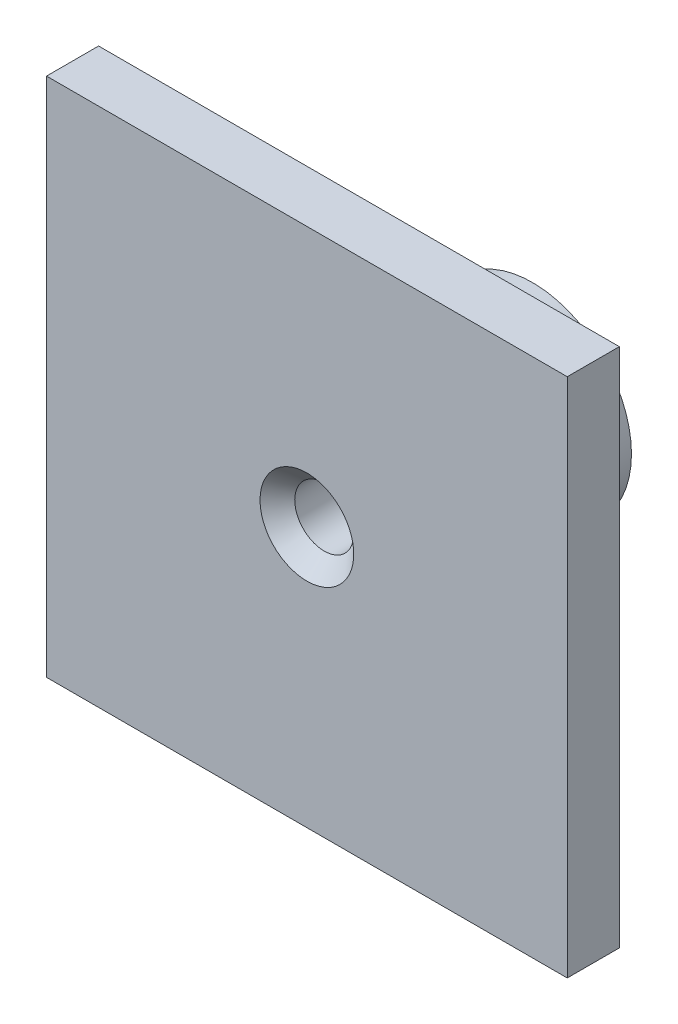
ISO-10303-21;
HEADER;
FILE_DESCRIPTION(('STEP AP214'),'2;1');
FILE_NAME('part.step','',(''),(''),'','','');
FILE_SCHEMA(('AUTOMOTIVE_DESIGN { 1 0 10303 214 1 1 1 1 }'));
ENDSEC;
DATA;
#1=APPLICATION_CONTEXT('core data for automotive mechanical design processes');
#2=APPLICATION_PROTOCOL_DEFINITION('international standard','automotive_design',2000,#1);
#3=PRODUCT_CONTEXT('',#1,'mechanical');
#4=PRODUCT('Part','Part','',(#3));
#5=PRODUCT_RELATED_PRODUCT_CATEGORY('part','',(#4));
#6=PRODUCT_DEFINITION_FORMATION('','',#4);
#7=PRODUCT_DEFINITION_CONTEXT('part definition',#1,'design');
#8=PRODUCT_DEFINITION('design','',#6,#7);
#9=PRODUCT_DEFINITION_SHAPE('','',#8);
#10=(LENGTH_UNIT() NAMED_UNIT(*) SI_UNIT(.MILLI.,.METRE.));
#11=(NAMED_UNIT(*) PLANE_ANGLE_UNIT() SI_UNIT($,.RADIAN.));
#12=(NAMED_UNIT(*) SI_UNIT($,.STERADIAN.) SOLID_ANGLE_UNIT());
#13=UNCERTAINTY_MEASURE_WITH_UNIT(LENGTH_MEASURE(1.E-05),#10,'distance_accuracy_value','');
#14=(GEOMETRIC_REPRESENTATION_CONTEXT(3) GLOBAL_UNCERTAINTY_ASSIGNED_CONTEXT((#13)) GLOBAL_UNIT_ASSIGNED_CONTEXT((#10,
#11,#12)) REPRESENTATION_CONTEXT('',''));
#15=CARTESIAN_POINT('',(0.,0.,0.));
#16=DIRECTION('',(0.,0.,1.));
#17=DIRECTION('',(1.,0.,0.));
#18=AXIS2_PLACEMENT_3D('',#15,#16,#17);
#19=CARTESIAN_POINT('',(7.5,-7.5,1.5));
#20=DIRECTION('',(-1.,0.,0.));
#21=DIRECTION('',(0.,0.,1.));
#22=AXIS2_PLACEMENT_3D('',#19,#20,#21);
#23=PLANE('',#22);
#24=DIRECTION('',(0.,1.,0.));
#25=VECTOR('',#24,1.);
#26=CARTESIAN_POINT('',(7.5,-7.5,0.));
#27=LINE('',#26,#25);
#28=CARTESIAN_POINT('',(7.5,-7.5,0.));
#29=VERTEX_POINT('',#28);
#30=CARTESIAN_POINT('',(7.5,7.5,0.));
#31=VERTEX_POINT('',#30);
#32=EDGE_CURVE('E103',#29,#31,#27,.T.);
#33=ORIENTED_EDGE('',*,*,#32,.T.);
#34=DIRECTION('',(0.,0.,-1.));
#35=VECTOR('',#34,1.);
#36=CARTESIAN_POINT('',(7.5,7.5,1.5));
#37=LINE('',#36,#35);
#38=CARTESIAN_POINT('',(7.5,7.5,1.5));
#39=VERTEX_POINT('',#38);
#40=EDGE_CURVE('E94',#39,#31,#37,.T.);
#41=ORIENTED_EDGE('',*,*,#40,.F.);
#42=DIRECTION('',(0.,1.,0.));
#43=VECTOR('',#42,1.);
#44=CARTESIAN_POINT('',(7.5,-7.5,1.5));
#45=LINE('',#44,#43);
#46=CARTESIAN_POINT('',(7.5,-7.5,1.5));
#47=VERTEX_POINT('',#46);
#48=EDGE_CURVE('E88',#47,#39,#45,.T.);
#49=ORIENTED_EDGE('',*,*,#48,.F.);
#50=DIRECTION('',(0.,0.,-1.));
#51=VECTOR('',#50,1.);
#52=CARTESIAN_POINT('',(7.5,-7.5,1.5));
#53=LINE('',#52,#51);
#54=EDGE_CURVE('E99',#47,#29,#53,.T.);
#55=ORIENTED_EDGE('',*,*,#54,.T.);
#56=EDGE_LOOP('',(#33,#41,#49,#55));
#57=FACE_BOUND('',#56,.T.);
#58=ADVANCED_FACE('F35',(#57),#23,.F.);
#59=CARTESIAN_POINT('',(-7.5,7.5,1.5));
#60=DIRECTION('',(0.,-1.,0.));
#61=DIRECTION('',(0.,0.,-1.));
#62=AXIS2_PLACEMENT_3D('',#59,#60,#61);
#63=PLANE('',#62);
#64=DIRECTION('',(-1.,0.,0.));
#65=VECTOR('',#64,1.);
#66=CARTESIAN_POINT('',(-7.5,7.5,0.));
#67=LINE('',#66,#65);
#68=CARTESIAN_POINT('',(-7.5,7.5,0.));
#69=VERTEX_POINT('',#68);
#70=EDGE_CURVE('E93',#31,#69,#67,.T.);
#71=ORIENTED_EDGE('',*,*,#70,.T.);
#72=DIRECTION('',(0.,0.,-1.));
#73=VECTOR('',#72,1.);
#74=CARTESIAN_POINT('',(-7.5,7.5,1.5));
#75=LINE('',#74,#73);
#76=CARTESIAN_POINT('',(-7.5,7.5,1.5));
#77=VERTEX_POINT('',#76);
#78=EDGE_CURVE('E91',#77,#69,#75,.T.);
#79=ORIENTED_EDGE('',*,*,#78,.F.);
#80=DIRECTION('',(-1.,0.,0.));
#81=VECTOR('',#80,1.);
#82=CARTESIAN_POINT('',(-7.5,7.5,1.5));
#83=LINE('',#82,#81);
#84=EDGE_CURVE('E83',#39,#77,#83,.T.);
#85=ORIENTED_EDGE('',*,*,#84,.F.);
#86=ORIENTED_EDGE('',*,*,#40,.T.);
#87=EDGE_LOOP('',(#71,#79,#85,#86));
#88=FACE_BOUND('',#87,.T.);
#89=ADVANCED_FACE('F92',(#88),#63,.F.);
#90=CARTESIAN_POINT('',(-7.5,-7.5,1.5));
#91=DIRECTION('',(1.,0.,0.));
#92=DIRECTION('',(0.,0.,-1.));
#93=AXIS2_PLACEMENT_3D('',#90,#91,#92);
#94=PLANE('',#93);
#95=DIRECTION('',(0.,-1.,0.));
#96=VECTOR('',#95,1.);
#97=CARTESIAN_POINT('',(-7.5,-7.5,0.));
#98=LINE('',#97,#96);
#99=CARTESIAN_POINT('',(-7.5,-7.5,0.));
#100=VERTEX_POINT('',#99);
#101=EDGE_CURVE('E69',#69,#100,#98,.T.);
#102=ORIENTED_EDGE('',*,*,#101,.T.);
#103=DIRECTION('',(0.,0.,-1.));
#104=VECTOR('',#103,1.);
#105=CARTESIAN_POINT('',(-7.5,-7.5,1.5));
#106=LINE('',#105,#104);
#107=CARTESIAN_POINT('',(-7.5,-7.5,1.5));
#108=VERTEX_POINT('',#107);
#109=EDGE_CURVE('E95',#108,#100,#106,.T.);
#110=ORIENTED_EDGE('',*,*,#109,.F.);
#111=DIRECTION('',(0.,-1.,0.));
#112=VECTOR('',#111,1.);
#113=CARTESIAN_POINT('',(-7.5,-7.5,1.5));
#114=LINE('',#113,#112);
#115=EDGE_CURVE('E86',#77,#108,#114,.T.);
#116=ORIENTED_EDGE('',*,*,#115,.F.);
#117=ORIENTED_EDGE('',*,*,#78,.T.);
#118=EDGE_LOOP('',(#102,#110,#116,#117));
#119=FACE_BOUND('',#118,.T.);
#120=ADVANCED_FACE('F97',(#119),#94,.F.);
#121=CARTESIAN_POINT('',(-7.5,-7.5,1.5));
#122=DIRECTION('',(0.,1.,0.));
#123=DIRECTION('',(0.,0.,1.));
#124=AXIS2_PLACEMENT_3D('',#121,#122,#123);
#125=PLANE('',#124);
#126=DIRECTION('',(1.,0.,0.));
#127=VECTOR('',#126,1.);
#128=CARTESIAN_POINT('',(-7.5,-7.5,0.));
#129=LINE('',#128,#127);
#130=EDGE_CURVE('E75',#100,#29,#129,.T.);
#131=ORIENTED_EDGE('',*,*,#130,.T.);
#132=ORIENTED_EDGE('',*,*,#54,.F.);
#133=DIRECTION('',(1.,0.,0.));
#134=VECTOR('',#133,1.);
#135=CARTESIAN_POINT('',(-7.5,-7.5,1.5));
#136=LINE('',#135,#134);
#137=EDGE_CURVE('E52',#108,#47,#136,.T.);
#138=ORIENTED_EDGE('',*,*,#137,.F.);
#139=ORIENTED_EDGE('',*,*,#109,.T.);
#140=EDGE_LOOP('',(#131,#132,#138,#139));
#141=FACE_BOUND('',#140,.T.);
#142=ADVANCED_FACE('F142',(#141),#125,.F.);
#143=CARTESIAN_POINT('',(0.,0.,1.5));
#144=DIRECTION('',(0.,0.,-1.));
#145=DIRECTION('',(-1.,0.,0.));
#146=AXIS2_PLACEMENT_3D('',#143,#144,#145);
#147=PLANE('',#146);
#148=CARTESIAN_POINT('',(0.,0.,1.5));
#149=DIRECTION('',(0.,0.,-1.));
#150=DIRECTION('',(-1.,0.,0.));
#151=AXIS2_PLACEMENT_3D('',#148,#149,#150);
#152=CIRCLE('',#151,1.35000000000001);
#153=CARTESIAN_POINT('',(-1.35000000000001,0.,1.5));
#154=VERTEX_POINT('',#153);
#155=EDGE_CURVE('E11',#154,#154,#152,.T.);
#156=ORIENTED_EDGE('',*,*,#155,.T.);
#157=EDGE_LOOP('',(#156));
#158=FACE_BOUND('',#157,.T.);
#159=ORIENTED_EDGE('',*,*,#48,.T.);
#160=ORIENTED_EDGE('',*,*,#84,.T.);
#161=ORIENTED_EDGE('',*,*,#115,.T.);
#162=ORIENTED_EDGE('',*,*,#137,.T.);
#163=EDGE_LOOP('',(#159,#160,#161,#162));
#164=FACE_BOUND('',#163,.T.);
#165=ADVANCED_FACE('F84',(#158,#164),#147,.F.);
#166=CARTESIAN_POINT('',(0.,0.,0.));
#167=DIRECTION('',(0.,0.,-1.));
#168=DIRECTION('',(-1.,0.,0.));
#169=AXIS2_PLACEMENT_3D('',#166,#167,#168);
#170=PLANE('',#169);
#171=CARTESIAN_POINT('',(0.,0.,0.));
#172=DIRECTION('',(0.,0.,-1.));
#173=DIRECTION('',(-1.,0.,0.));
#174=AXIS2_PLACEMENT_3D('',#171,#172,#173);
#175=CIRCLE('',#174,4.85000000000002);
#176=CARTESIAN_POINT('',(-4.85000000000002,0.,0.));
#177=VERTEX_POINT('',#176);
#178=EDGE_CURVE('E113',#177,#177,#175,.F.);
#179=ORIENTED_EDGE('',*,*,#178,.T.);
#180=EDGE_LOOP('',(#179));
#181=FACE_BOUND('',#180,.T.);
#182=ORIENTED_EDGE('',*,*,#32,.F.);
#183=ORIENTED_EDGE('',*,*,#130,.F.);
#184=ORIENTED_EDGE('',*,*,#101,.F.);
#185=ORIENTED_EDGE('',*,*,#70,.F.);
#186=EDGE_LOOP('',(#182,#183,#184,#185));
#187=FACE_BOUND('',#186,.T.);
#188=ADVANCED_FACE('F145',(#181,#187),#170,.T.);
#189=CARTESIAN_POINT('',(0.,0.,-5.));
#190=DIRECTION('',(0.,0.,1.));
#191=DIRECTION('',(1.,0.,0.));
#192=AXIS2_PLACEMENT_3D('',#189,#190,#191);
#193=CYLINDRICAL_SURFACE('',#192,2.85);
#194=CARTESIAN_POINT('',(0.,0.,-2.));
#195=DIRECTION('',(0.,0.,-1.));
#196=DIRECTION('',(-1.,0.,0.));
#197=AXIS2_PLACEMENT_3D('',#194,#195,#196);
#198=CIRCLE('',#197,2.85);
#199=CARTESIAN_POINT('',(-2.85,0.,-2.));
#200=VERTEX_POINT('',#199);
#201=EDGE_CURVE('E116',#200,#200,#198,.T.);
#202=ORIENTED_EDGE('',*,*,#201,.T.);
#203=EDGE_LOOP('',(#202));
#204=FACE_BOUND('',#203,.T.);
#205=CARTESIAN_POINT('',(0.,0.,-5.));
#206=DIRECTION('',(0.,0.,1.));
#207=DIRECTION('',(1.,0.,0.));
#208=AXIS2_PLACEMENT_3D('',#205,#206,#207);
#209=CIRCLE('',#208,2.85);
#210=CARTESIAN_POINT('',(2.85,0.,-5.));
#211=VERTEX_POINT('',#210);
#212=EDGE_CURVE('E106',#211,#211,#209,.T.);
#213=ORIENTED_EDGE('',*,*,#212,.T.);
#214=EDGE_LOOP('',(#213));
#215=FACE_BOUND('',#214,.T.);
#216=ADVANCED_FACE('F148',(#204,#215),#193,.T.);
#217=CARTESIAN_POINT('',(0.,0.,-5.));
#218=DIRECTION('',(0.,0.,1.));
#219=DIRECTION('',(1.,0.,0.));
#220=AXIS2_PLACEMENT_3D('',#217,#218,#219);
#221=PLANE('',#220);
#222=CARTESIAN_POINT('',(0.,0.,-5.));
#223=DIRECTION('',(0.,0.,1.));
#224=DIRECTION('',(1.,0.,0.));
#225=AXIS2_PLACEMENT_3D('',#222,#223,#224);
#226=CIRCLE('',#225,0.85);
#227=CARTESIAN_POINT('',(0.85,0.,-5.));
#228=VERTEX_POINT('',#227);
#229=EDGE_CURVE('E229',#228,#228,#226,.T.);
#230=ORIENTED_EDGE('',*,*,#229,.T.);
#231=EDGE_LOOP('',(#230));
#232=FACE_BOUND('',#231,.T.);
#233=ORIENTED_EDGE('',*,*,#212,.F.);
#234=EDGE_LOOP('',(#233));
#235=FACE_BOUND('',#234,.T.);
#236=ADVANCED_FACE('F155',(#232,#235),#221,.F.);
#237=CARTESIAN_POINT('',(0.,0.,-5.));
#238=DIRECTION('',(0.,0.,1.));
#239=DIRECTION('',(1.,0.,0.));
#240=AXIS2_PLACEMENT_3D('',#237,#238,#239);
#241=CYLINDRICAL_SURFACE('',#240,0.85);
#242=CARTESIAN_POINT('',(0.,0.,0.999999999999993));
#243=DIRECTION('',(0.,0.,-1.));
#244=DIRECTION('',(-1.,0.,0.));
#245=AXIS2_PLACEMENT_3D('',#242,#243,#244);
#246=CIRCLE('',#245,0.85);
#247=CARTESIAN_POINT('',(-0.85,0.,0.999999999999993));
#248=VERTEX_POINT('',#247);
#249=EDGE_CURVE('E44',#248,#248,#246,.F.);
#250=ORIENTED_EDGE('',*,*,#249,.T.);
#251=EDGE_LOOP('',(#250));
#252=FACE_BOUND('',#251,.T.);
#253=ORIENTED_EDGE('',*,*,#229,.F.);
#254=EDGE_LOOP('',(#253));
#255=FACE_BOUND('',#254,.T.);
#256=ADVANCED_FACE('F121',(#252,#255),#241,.F.);
#257=CARTESIAN_POINT('',(0.,0.,0.));
#258=DIRECTION('',(0.,0.,1.));
#259=DIRECTION('',(1.,0.,0.));
#260=AXIS2_PLACEMENT_3D('',#257,#258,#259);
#261=CONICAL_SURFACE('',#260,4.85000000000002,0.785398163397453);
#262=ORIENTED_EDGE('',*,*,#201,.F.);
#263=EDGE_LOOP('',(#262));
#264=FACE_BOUND('',#263,.T.);
#265=ORIENTED_EDGE('',*,*,#178,.F.);
#266=EDGE_LOOP('',(#265));
#267=FACE_BOUND('',#266,.T.);
#268=ADVANCED_FACE('F125',(#264,#267),#261,.T.);
#269=CARTESIAN_POINT('',(0.,0.,0.999999999999993));
#270=DIRECTION('',(0.,0.,1.));
#271=DIRECTION('',(1.,0.,0.));
#272=AXIS2_PLACEMENT_3D('',#269,#270,#271);
#273=CONICAL_SURFACE('',#272,0.85,0.785398163397452);
#274=ORIENTED_EDGE('',*,*,#155,.F.);
#275=EDGE_LOOP('',(#274));
#276=FACE_BOUND('',#275,.T.);
#277=ORIENTED_EDGE('',*,*,#249,.F.);
#278=EDGE_LOOP('',(#277));
#279=FACE_BOUND('',#278,.T.);
#280=ADVANCED_FACE('F37',(#276,#279),#273,.F.);
#281=CLOSED_SHELL('',(#58,#89,#120,#142,#165,#188,#216,#236,#256,#268,#280));
#282=MANIFOLD_SOLID_BREP('B2',#281);
#283=ADVANCED_BREP_SHAPE_REPRESENTATION('',(#18,#282),#14);
#284=SHAPE_DEFINITION_REPRESENTATION(#9,#283);
ENDSEC;
END-ISO-10303-21;
